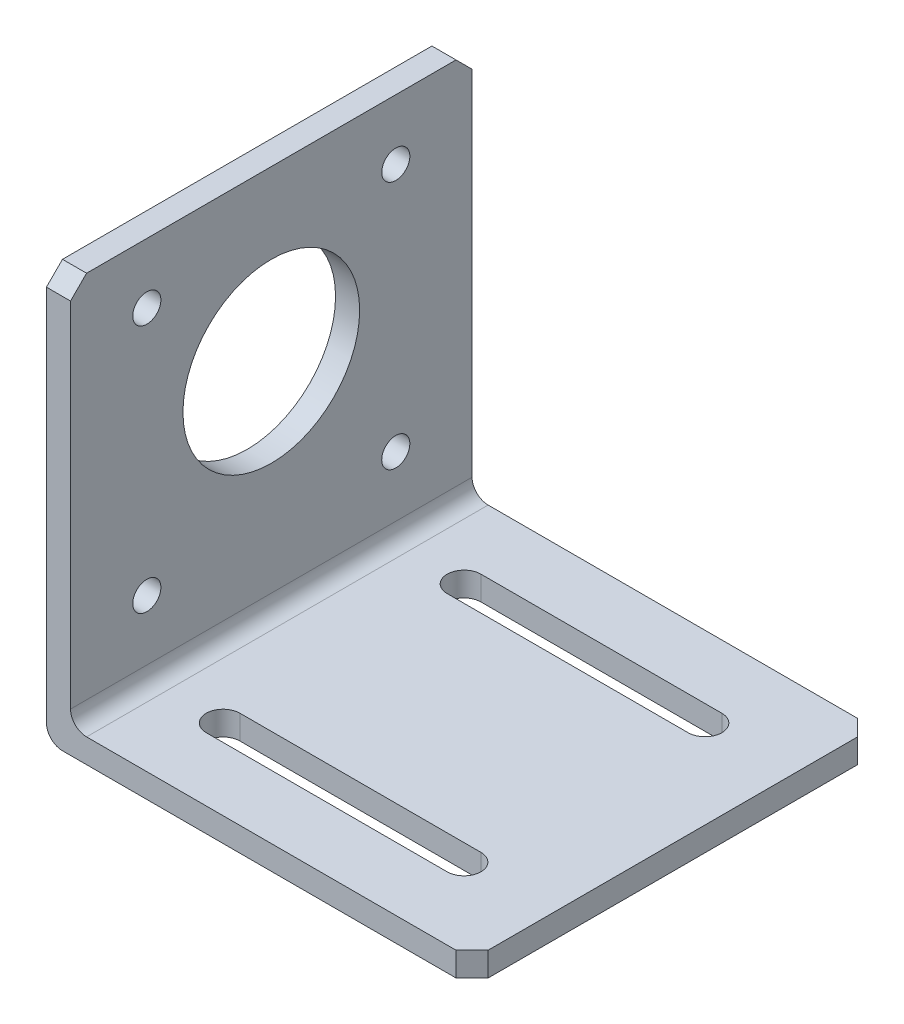
ISO-10303-21;
HEADER;
FILE_DESCRIPTION(('STEP AP214'),'2;1');
FILE_NAME('part.step','',(''),(''),'','','');
FILE_SCHEMA(('AUTOMOTIVE_DESIGN { 1 0 10303 214 1 1 1 1 }'));
ENDSEC;
DATA;
#1=APPLICATION_CONTEXT('core data for automotive mechanical design processes');
#2=APPLICATION_PROTOCOL_DEFINITION('international standard','automotive_design',2000,#1);
#3=PRODUCT_CONTEXT('',#1,'mechanical');
#4=PRODUCT('Part','Part','',(#3));
#5=PRODUCT_RELATED_PRODUCT_CATEGORY('part','',(#4));
#6=PRODUCT_DEFINITION_FORMATION('','',#4);
#7=PRODUCT_DEFINITION_CONTEXT('part definition',#1,'design');
#8=PRODUCT_DEFINITION('design','',#6,#7);
#9=PRODUCT_DEFINITION_SHAPE('','',#8);
#10=(LENGTH_UNIT() NAMED_UNIT(*) SI_UNIT(.MILLI.,.METRE.));
#11=(NAMED_UNIT(*) PLANE_ANGLE_UNIT() SI_UNIT($,.RADIAN.));
#12=(NAMED_UNIT(*) SI_UNIT($,.STERADIAN.) SOLID_ANGLE_UNIT());
#13=UNCERTAINTY_MEASURE_WITH_UNIT(LENGTH_MEASURE(1.E-05),#10,'distance_accuracy_value','');
#14=(GEOMETRIC_REPRESENTATION_CONTEXT(3) GLOBAL_UNCERTAINTY_ASSIGNED_CONTEXT((#13)) GLOBAL_UNIT_ASSIGNED_CONTEXT((#10,
#11,#12)) REPRESENTATION_CONTEXT('',''));
#15=CARTESIAN_POINT('',(0.,0.,0.));
#16=DIRECTION('',(0.,0.,1.));
#17=DIRECTION('',(1.,0.,0.));
#18=AXIS2_PLACEMENT_3D('',#15,#16,#17);
#19=CARTESIAN_POINT('',(2.,2.,0.));
#20=DIRECTION('',(0.,0.,1.));
#21=DIRECTION('',(1.,0.,0.));
#22=AXIS2_PLACEMENT_3D('',#19,#20,#21);
#23=PLANE('',#22);
#24=DIRECTION('',(0.,1.,0.));
#25=VECTOR('',#24,1.);
#26=CARTESIAN_POINT('',(51.,0.,0.));
#27=LINE('',#26,#25);
#28=CARTESIAN_POINT('',(51.,0.,0.));
#29=VERTEX_POINT('',#28);
#30=CARTESIAN_POINT('',(51.,3.,0.));
#31=VERTEX_POINT('',#30);
#32=EDGE_CURVE('E364',#29,#31,#27,.T.);
#33=ORIENTED_EDGE('',*,*,#32,.F.);
#34=DIRECTION('',(1.,0.,0.));
#35=VECTOR('',#34,1.);
#36=CARTESIAN_POINT('',(2.00000000000001,0.,0.));
#37=LINE('',#36,#35);
#38=CARTESIAN_POINT('',(2.00000000000001,0.,0.));
#39=VERTEX_POINT('',#38);
#40=EDGE_CURVE('E214',#39,#29,#37,.T.);
#41=ORIENTED_EDGE('',*,*,#40,.F.);
#42=CARTESIAN_POINT('',(2.,2.,0.));
#43=DIRECTION('',(0.,0.,1.));
#44=DIRECTION('',(1.,0.,0.));
#45=AXIS2_PLACEMENT_3D('',#42,#43,#44);
#46=CIRCLE('',#45,2.);
#47=CARTESIAN_POINT('',(0.,2.00000000000001,0.));
#48=VERTEX_POINT('',#47);
#49=EDGE_CURVE('E211',#48,#39,#46,.T.);
#50=ORIENTED_EDGE('',*,*,#49,.F.);
#51=DIRECTION('',(0.,-1.,0.));
#52=VECTOR('',#51,1.);
#53=CARTESIAN_POINT('',(0.,51.,0.));
#54=LINE('',#53,#52);
#55=CARTESIAN_POINT('',(0.,49.,0.));
#56=VERTEX_POINT('',#55);
#57=EDGE_CURVE('E209',#56,#48,#54,.T.);
#58=ORIENTED_EDGE('',*,*,#57,.F.);
#59=DIRECTION('',(1.,0.,0.));
#60=VECTOR('',#59,1.);
#61=CARTESIAN_POINT('',(0.,49.,0.));
#62=LINE('',#61,#60);
#63=CARTESIAN_POINT('',(3.,49.,0.));
#64=VERTEX_POINT('',#63);
#65=EDGE_CURVE('E304',#56,#64,#62,.T.);
#66=ORIENTED_EDGE('',*,*,#65,.T.);
#67=DIRECTION('',(0.,1.,0.));
#68=VECTOR('',#67,1.);
#69=CARTESIAN_POINT('',(3.,5.00000000000002,0.));
#70=LINE('',#69,#68);
#71=CARTESIAN_POINT('',(3.,5.,0.));
#72=VERTEX_POINT('',#71);
#73=EDGE_CURVE('E221',#72,#64,#70,.T.);
#74=ORIENTED_EDGE('',*,*,#73,.F.);
#75=CARTESIAN_POINT('',(5.,5.,0.));
#76=DIRECTION('',(0.,0.,-1.));
#77=DIRECTION('',(-1.,0.,0.));
#78=AXIS2_PLACEMENT_3D('',#75,#76,#77);
#79=CIRCLE('',#78,2.);
#80=CARTESIAN_POINT('',(5.00000000000001,3.,0.));
#81=VERTEX_POINT('',#80);
#82=EDGE_CURVE('E219',#81,#72,#79,.T.);
#83=ORIENTED_EDGE('',*,*,#82,.F.);
#84=DIRECTION('',(-1.,0.,0.));
#85=VECTOR('',#84,1.);
#86=CARTESIAN_POINT('',(53.,3.,0.));
#87=LINE('',#86,#85);
#88=EDGE_CURVE('E217',#31,#81,#87,.T.);
#89=ORIENTED_EDGE('',*,*,#88,.F.);
#90=EDGE_LOOP('',(#33,#41,#50,#58,#66,#74,#83,#89));
#91=FACE_BOUND('',#90,.T.);
#92=ADVANCED_FACE('F38',(#91),#23,.F.);
#93=CARTESIAN_POINT('',(2.00000000000001,0.,50.));
#94=DIRECTION('',(0.,1.,0.));
#95=DIRECTION('',(0.,0.,1.));
#96=AXIS2_PLACEMENT_3D('',#93,#94,#95);
#97=PLANE('',#96);
#98=DIRECTION('',(1.,0.,0.));
#99=VECTOR('',#98,1.);
#100=CARTESIAN_POINT('',(2.00000000000001,0.,42.1));
#101=LINE('',#100,#99);
#102=CARTESIAN_POINT('',(12.,0.,42.1));
#103=VERTEX_POINT('',#102);
#104=CARTESIAN_POINT('',(42.,0.,42.1));
#105=VERTEX_POINT('',#104);
#106=EDGE_CURVE('E314',#103,#105,#101,.T.);
#107=ORIENTED_EDGE('',*,*,#106,.T.);
#108=CARTESIAN_POINT('',(42.,0.,40.));
#109=DIRECTION('',(0.,1.,0.));
#110=DIRECTION('',(0.,0.,1.));
#111=AXIS2_PLACEMENT_3D('',#108,#109,#110);
#112=CIRCLE('',#111,2.1);
#113=CARTESIAN_POINT('',(42.,0.,37.9));
#114=VERTEX_POINT('',#113);
#115=EDGE_CURVE('E288',#105,#114,#112,.T.);
#116=ORIENTED_EDGE('',*,*,#115,.T.);
#117=DIRECTION('',(1.,0.,0.));
#118=VECTOR('',#117,1.);
#119=CARTESIAN_POINT('',(2.00000000000001,0.,37.9));
#120=LINE('',#119,#118);
#121=CARTESIAN_POINT('',(12.,0.,37.9));
#122=VERTEX_POINT('',#121);
#123=EDGE_CURVE('E317',#122,#114,#120,.T.);
#124=ORIENTED_EDGE('',*,*,#123,.F.);
#125=CARTESIAN_POINT('',(12.,0.,40.));
#126=DIRECTION('',(0.,1.,0.));
#127=DIRECTION('',(0.,0.,1.));
#128=AXIS2_PLACEMENT_3D('',#125,#126,#127);
#129=CIRCLE('',#128,2.1);
#130=EDGE_CURVE('E275',#122,#103,#129,.T.);
#131=ORIENTED_EDGE('',*,*,#130,.T.);
#132=EDGE_LOOP('',(#107,#116,#124,#131));
#133=FACE_BOUND('',#132,.T.);
#134=CARTESIAN_POINT('',(12.,0.,10.));
#135=DIRECTION('',(0.,1.,0.));
#136=DIRECTION('',(0.,0.,1.));
#137=AXIS2_PLACEMENT_3D('',#134,#135,#136);
#138=CIRCLE('',#137,2.1);
#139=CARTESIAN_POINT('',(12.,0.,12.1));
#140=VERTEX_POINT('',#139);
#141=CARTESIAN_POINT('',(12.,0.,7.9));
#142=VERTEX_POINT('',#141);
#143=EDGE_CURVE('E305',#140,#142,#138,.F.);
#144=ORIENTED_EDGE('',*,*,#143,.F.);
#145=DIRECTION('',(1.,0.,0.));
#146=VECTOR('',#145,1.);
#147=CARTESIAN_POINT('',(2.00000000000001,0.,12.1));
#148=LINE('',#147,#146);
#149=CARTESIAN_POINT('',(42.,0.,12.1));
#150=VERTEX_POINT('',#149);
#151=EDGE_CURVE('E311',#140,#150,#148,.T.);
#152=ORIENTED_EDGE('',*,*,#151,.T.);
#153=CARTESIAN_POINT('',(42.,0.,10.));
#154=DIRECTION('',(0.,1.,0.));
#155=DIRECTION('',(0.,0.,1.));
#156=AXIS2_PLACEMENT_3D('',#153,#154,#155);
#157=CIRCLE('',#156,2.1);
#158=CARTESIAN_POINT('',(42.,0.,7.9));
#159=VERTEX_POINT('',#158);
#160=EDGE_CURVE('E309',#159,#150,#157,.F.);
#161=ORIENTED_EDGE('',*,*,#160,.F.);
#162=DIRECTION('',(1.,0.,0.));
#163=VECTOR('',#162,1.);
#164=CARTESIAN_POINT('',(2.00000000000001,0.,7.9));
#165=LINE('',#164,#163);
#166=EDGE_CURVE('E307',#142,#159,#165,.T.);
#167=ORIENTED_EDGE('',*,*,#166,.F.);
#168=EDGE_LOOP('',(#144,#152,#161,#167));
#169=FACE_BOUND('',#168,.T.);
#170=DIRECTION('',(0.,0.,-1.));
#171=VECTOR('',#170,1.);
#172=CARTESIAN_POINT('',(53.,0.,50.));
#173=LINE('',#172,#171);
#174=CARTESIAN_POINT('',(53.,0.,48.));
#175=VERTEX_POINT('',#174);
#176=CARTESIAN_POINT('',(53.,0.,1.99999999999999));
#177=VERTEX_POINT('',#176);
#178=EDGE_CURVE('E190',#175,#177,#173,.T.);
#179=ORIENTED_EDGE('',*,*,#178,.F.);
#180=DIRECTION('',(-0.707106781186549,0.,0.707106781186546));
#181=VECTOR('',#180,1.);
#182=CARTESIAN_POINT('',(53.,0.,48.));
#183=LINE('',#182,#181);
#184=CARTESIAN_POINT('',(51.,0.,50.));
#185=VERTEX_POINT('',#184);
#186=EDGE_CURVE('E175',#175,#185,#183,.T.);
#187=ORIENTED_EDGE('',*,*,#186,.T.);
#188=DIRECTION('',(1.,0.,0.));
#189=VECTOR('',#188,1.);
#190=CARTESIAN_POINT('',(2.00000000000001,0.,50.));
#191=LINE('',#190,#189);
#192=CARTESIAN_POINT('',(2.00000000000001,0.,50.));
#193=VERTEX_POINT('',#192);
#194=EDGE_CURVE('E187',#193,#185,#191,.T.);
#195=ORIENTED_EDGE('',*,*,#194,.F.);
#196=DIRECTION('',(0.,0.,-1.));
#197=VECTOR('',#196,1.);
#198=CARTESIAN_POINT('',(2.00000000000001,0.,50.));
#199=LINE('',#198,#197);
#200=EDGE_CURVE('E236',#193,#39,#199,.T.);
#201=ORIENTED_EDGE('',*,*,#200,.T.);
#202=ORIENTED_EDGE('',*,*,#40,.T.);
#203=DIRECTION('',(-0.707106781186549,0.,-0.707106781186546));
#204=VECTOR('',#203,1.);
#205=CARTESIAN_POINT('',(53.,0.,1.99999999999999));
#206=LINE('',#205,#204);
#207=EDGE_CURVE('E366',#177,#29,#206,.T.);
#208=ORIENTED_EDGE('',*,*,#207,.F.);
#209=EDGE_LOOP('',(#179,#187,#195,#201,#202,#208));
#210=FACE_BOUND('',#209,.T.);
#211=ADVANCED_FACE('F185',(#133,#169,#210),#97,.F.);
#212=CARTESIAN_POINT('',(53.,3.,50.));
#213=DIRECTION('',(0.,-1.,0.));
#214=DIRECTION('',(0.,0.,-1.));
#215=AXIS2_PLACEMENT_3D('',#212,#213,#214);
#216=PLANE('',#215);
#217=DIRECTION('',(-1.,0.,0.));
#218=VECTOR('',#217,1.);
#219=CARTESIAN_POINT('',(53.,3.,37.9));
#220=LINE('',#219,#218);
#221=CARTESIAN_POINT('',(42.,3.,37.9));
#222=VERTEX_POINT('',#221);
#223=CARTESIAN_POINT('',(12.,3.,37.9));
#224=VERTEX_POINT('',#223);
#225=EDGE_CURVE('E46',#222,#224,#220,.T.);
#226=ORIENTED_EDGE('',*,*,#225,.F.);
#227=CARTESIAN_POINT('',(42.,3.,40.));
#228=DIRECTION('',(0.,-1.,0.));
#229=DIRECTION('',(0.,0.,-1.));
#230=AXIS2_PLACEMENT_3D('',#227,#228,#229);
#231=CIRCLE('',#230,2.1);
#232=CARTESIAN_POINT('',(42.,3.,42.1));
#233=VERTEX_POINT('',#232);
#234=EDGE_CURVE('E11',#222,#233,#231,.T.);
#235=ORIENTED_EDGE('',*,*,#234,.T.);
#236=DIRECTION('',(-1.,0.,0.));
#237=VECTOR('',#236,1.);
#238=CARTESIAN_POINT('',(53.,3.,42.1));
#239=LINE('',#238,#237);
#240=CARTESIAN_POINT('',(12.,3.,42.1));
#241=VERTEX_POINT('',#240);
#242=EDGE_CURVE('E254',#233,#241,#239,.T.);
#243=ORIENTED_EDGE('',*,*,#242,.T.);
#244=CARTESIAN_POINT('',(12.,3.,40.));
#245=DIRECTION('',(0.,-1.,0.));
#246=DIRECTION('',(0.,0.,-1.));
#247=AXIS2_PLACEMENT_3D('',#244,#245,#246);
#248=CIRCLE('',#247,2.1);
#249=EDGE_CURVE('E257',#241,#224,#248,.T.);
#250=ORIENTED_EDGE('',*,*,#249,.T.);
#251=EDGE_LOOP('',(#226,#235,#243,#250));
#252=FACE_BOUND('',#251,.T.);
#253=CARTESIAN_POINT('',(42.,3.,10.));
#254=DIRECTION('',(0.,-1.,0.));
#255=DIRECTION('',(0.,0.,-1.));
#256=AXIS2_PLACEMENT_3D('',#253,#254,#255);
#257=CIRCLE('',#256,2.1);
#258=CARTESIAN_POINT('',(42.,3.,12.1));
#259=VERTEX_POINT('',#258);
#260=CARTESIAN_POINT('',(42.,3.,7.9));
#261=VERTEX_POINT('',#260);
#262=EDGE_CURVE('E249',#259,#261,#257,.F.);
#263=ORIENTED_EDGE('',*,*,#262,.F.);
#264=DIRECTION('',(-1.,0.,0.));
#265=VECTOR('',#264,1.);
#266=CARTESIAN_POINT('',(53.,3.,12.1));
#267=LINE('',#266,#265);
#268=CARTESIAN_POINT('',(12.,3.,12.1));
#269=VERTEX_POINT('',#268);
#270=EDGE_CURVE('E251',#259,#269,#267,.T.);
#271=ORIENTED_EDGE('',*,*,#270,.T.);
#272=CARTESIAN_POINT('',(12.,3.,10.));
#273=DIRECTION('',(0.,-1.,0.));
#274=DIRECTION('',(0.,0.,-1.));
#275=AXIS2_PLACEMENT_3D('',#272,#273,#274);
#276=CIRCLE('',#275,2.1);
#277=CARTESIAN_POINT('',(12.,3.,7.9));
#278=VERTEX_POINT('',#277);
#279=EDGE_CURVE('E244',#278,#269,#276,.F.);
#280=ORIENTED_EDGE('',*,*,#279,.F.);
#281=DIRECTION('',(-1.,0.,0.));
#282=VECTOR('',#281,1.);
#283=CARTESIAN_POINT('',(53.,3.,7.9));
#284=LINE('',#283,#282);
#285=EDGE_CURVE('E246',#261,#278,#284,.T.);
#286=ORIENTED_EDGE('',*,*,#285,.F.);
#287=EDGE_LOOP('',(#263,#271,#280,#286));
#288=FACE_BOUND('',#287,.T.);
#289=DIRECTION('',(-1.,0.,0.));
#290=VECTOR('',#289,1.);
#291=CARTESIAN_POINT('',(53.,3.,50.));
#292=LINE('',#291,#290);
#293=CARTESIAN_POINT('',(51.,3.,50.));
#294=VERTEX_POINT('',#293);
#295=CARTESIAN_POINT('',(5.00000000000001,3.,50.));
#296=VERTEX_POINT('',#295);
#297=EDGE_CURVE('E196',#294,#296,#292,.T.);
#298=ORIENTED_EDGE('',*,*,#297,.F.);
#299=DIRECTION('',(-0.707106781186549,0.,0.707106781186546));
#300=VECTOR('',#299,1.);
#301=CARTESIAN_POINT('',(53.,3.,48.));
#302=LINE('',#301,#300);
#303=CARTESIAN_POINT('',(53.,3.,48.));
#304=VERTEX_POINT('',#303);
#305=EDGE_CURVE('E61',#304,#294,#302,.T.);
#306=ORIENTED_EDGE('',*,*,#305,.F.);
#307=DIRECTION('',(0.,0.,-1.));
#308=VECTOR('',#307,1.);
#309=CARTESIAN_POINT('',(53.,3.,50.));
#310=LINE('',#309,#308);
#311=CARTESIAN_POINT('',(53.,3.,1.99999999999999));
#312=VERTEX_POINT('',#311);
#313=EDGE_CURVE('E232',#304,#312,#310,.T.);
#314=ORIENTED_EDGE('',*,*,#313,.T.);
#315=DIRECTION('',(-0.707106781186549,0.,-0.707106781186546));
#316=VECTOR('',#315,1.);
#317=CARTESIAN_POINT('',(53.,3.,1.99999999999999));
#318=LINE('',#317,#316);
#319=EDGE_CURVE('E53',#312,#31,#318,.T.);
#320=ORIENTED_EDGE('',*,*,#319,.T.);
#321=ORIENTED_EDGE('',*,*,#88,.T.);
#322=DIRECTION('',(0.,0.,-1.));
#323=VECTOR('',#322,1.);
#324=CARTESIAN_POINT('',(5.00000000000001,3.,50.));
#325=LINE('',#324,#323);
#326=EDGE_CURVE('E229',#296,#81,#325,.T.);
#327=ORIENTED_EDGE('',*,*,#326,.F.);
#328=EDGE_LOOP('',(#298,#306,#314,#320,#321,#327));
#329=FACE_BOUND('',#328,.T.);
#330=ADVANCED_FACE('F278',(#252,#288,#329),#216,.F.);
#331=CARTESIAN_POINT('',(53.,0.,50.));
#332=DIRECTION('',(-1.,0.,0.));
#333=DIRECTION('',(0.,0.,1.));
#334=AXIS2_PLACEMENT_3D('',#331,#332,#333);
#335=PLANE('',#334);
#336=ORIENTED_EDGE('',*,*,#313,.F.);
#337=DIRECTION('',(0.,1.,0.));
#338=VECTOR('',#337,1.);
#339=CARTESIAN_POINT('',(53.,0.,48.));
#340=LINE('',#339,#338);
#341=EDGE_CURVE('E180',#175,#304,#340,.T.);
#342=ORIENTED_EDGE('',*,*,#341,.F.);
#343=ORIENTED_EDGE('',*,*,#178,.T.);
#344=DIRECTION('',(0.,1.,0.));
#345=VECTOR('',#344,1.);
#346=CARTESIAN_POINT('',(53.,0.,1.99999999999999));
#347=LINE('',#346,#345);
#348=EDGE_CURVE('E367',#177,#312,#347,.T.);
#349=ORIENTED_EDGE('',*,*,#348,.T.);
#350=EDGE_LOOP('',(#336,#342,#343,#349));
#351=FACE_BOUND('',#350,.T.);
#352=ADVANCED_FACE('F440',(#351),#335,.F.);
#353=CARTESIAN_POINT('',(0.,51.,50.));
#354=DIRECTION('',(1.,0.,0.));
#355=DIRECTION('',(0.,1.,0.));
#356=AXIS2_PLACEMENT_3D('',#353,#354,#355);
#357=PLANE('',#356);
#358=CARTESIAN_POINT('',(0.,12.5,40.5));
#359=DIRECTION('',(1.,0.,0.));
#360=DIRECTION('',(0.,0.,-1.));
#361=AXIS2_PLACEMENT_3D('',#358,#359,#360);
#362=CIRCLE('',#361,1.75);
#363=CARTESIAN_POINT('',(0.,12.5,38.75));
#364=VERTEX_POINT('',#363);
#365=EDGE_CURVE('E337',#364,#364,#362,.T.);
#366=ORIENTED_EDGE('',*,*,#365,.T.);
#367=EDGE_LOOP('',(#366));
#368=FACE_BOUND('',#367,.T.);
#369=CARTESIAN_POINT('',(0.,30.,25.));
#370=DIRECTION('',(1.,0.,0.));
#371=DIRECTION('',(0.,0.,-1.));
#372=AXIS2_PLACEMENT_3D('',#369,#370,#371);
#373=CIRCLE('',#372,11.);
#374=CARTESIAN_POINT('',(0.,30.,14.));
#375=VERTEX_POINT('',#374);
#376=EDGE_CURVE('E325',#375,#375,#373,.T.);
#377=ORIENTED_EDGE('',*,*,#376,.T.);
#378=EDGE_LOOP('',(#377));
#379=FACE_BOUND('',#378,.T.);
#380=CARTESIAN_POINT('',(0.,43.5,40.5));
#381=DIRECTION('',(-1.,0.,0.));
#382=DIRECTION('',(0.,0.,1.));
#383=AXIS2_PLACEMENT_3D('',#380,#381,#382);
#384=CIRCLE('',#383,1.75);
#385=CARTESIAN_POINT('',(0.,43.5,42.25));
#386=VERTEX_POINT('',#385);
#387=EDGE_CURVE('E212',#386,#386,#384,.T.);
#388=ORIENTED_EDGE('',*,*,#387,.F.);
#389=EDGE_LOOP('',(#388));
#390=FACE_BOUND('',#389,.T.);
#391=CARTESIAN_POINT('',(0.,43.5,9.5));
#392=DIRECTION('',(1.,0.,0.));
#393=DIRECTION('',(0.,0.,-1.));
#394=AXIS2_PLACEMENT_3D('',#391,#392,#393);
#395=CIRCLE('',#394,1.75);
#396=CARTESIAN_POINT('',(0.,43.5,7.75));
#397=VERTEX_POINT('',#396);
#398=EDGE_CURVE('E331',#397,#397,#395,.T.);
#399=ORIENTED_EDGE('',*,*,#398,.T.);
#400=EDGE_LOOP('',(#399));
#401=FACE_BOUND('',#400,.T.);
#402=CARTESIAN_POINT('',(0.,12.5,9.5));
#403=DIRECTION('',(-1.,0.,0.));
#404=DIRECTION('',(0.,0.,1.));
#405=AXIS2_PLACEMENT_3D('',#402,#403,#404);
#406=CIRCLE('',#405,1.75);
#407=CARTESIAN_POINT('',(0.,12.5,11.25));
#408=VERTEX_POINT('',#407);
#409=EDGE_CURVE('E320',#408,#408,#406,.T.);
#410=ORIENTED_EDGE('',*,*,#409,.F.);
#411=EDGE_LOOP('',(#410));
#412=FACE_BOUND('',#411,.T.);
#413=DIRECTION('',(0.,0.707106781186546,0.707106781186549));
#414=VECTOR('',#413,1.);
#415=CARTESIAN_POINT('',(0.,49.,0.));
#416=LINE('',#415,#414);
#417=CARTESIAN_POINT('',(0.,51.,2.));
#418=VERTEX_POINT('',#417);
#419=EDGE_CURVE('E373',#56,#418,#416,.T.);
#420=ORIENTED_EDGE('',*,*,#419,.F.);
#421=ORIENTED_EDGE('',*,*,#57,.T.);
#422=DIRECTION('',(0.,0.,-1.));
#423=VECTOR('',#422,1.);
#424=CARTESIAN_POINT('',(0.,2.00000000000001,50.));
#425=LINE('',#424,#423);
#426=CARTESIAN_POINT('',(0.,2.00000000000001,50.));
#427=VERTEX_POINT('',#426);
#428=EDGE_CURVE('E238',#427,#48,#425,.T.);
#429=ORIENTED_EDGE('',*,*,#428,.F.);
#430=DIRECTION('',(0.,-1.,0.));
#431=VECTOR('',#430,1.);
#432=CARTESIAN_POINT('',(0.,51.,50.));
#433=LINE('',#432,#431);
#434=CARTESIAN_POINT('',(0.,49.,50.));
#435=VERTEX_POINT('',#434);
#436=EDGE_CURVE('E200',#435,#427,#433,.T.);
#437=ORIENTED_EDGE('',*,*,#436,.F.);
#438=DIRECTION('',(0.,0.707106781186546,-0.707106781186549));
#439=VECTOR('',#438,1.);
#440=CARTESIAN_POINT('',(0.,49.,50.));
#441=LINE('',#440,#439);
#442=CARTESIAN_POINT('',(0.,51.,48.));
#443=VERTEX_POINT('',#442);
#444=EDGE_CURVE('E387',#435,#443,#441,.T.);
#445=ORIENTED_EDGE('',*,*,#444,.T.);
#446=DIRECTION('',(0.,0.,-1.));
#447=VECTOR('',#446,1.);
#448=CARTESIAN_POINT('',(0.,51.,50.));
#449=LINE('',#448,#447);
#450=EDGE_CURVE('E241',#443,#418,#449,.T.);
#451=ORIENTED_EDGE('',*,*,#450,.T.);
#452=EDGE_LOOP('',(#420,#421,#429,#437,#445,#451));
#453=FACE_BOUND('',#452,.T.);
#454=ADVANCED_FACE('F355',(#368,#379,#390,#401,#412,#453),#357,.F.);
#455=CARTESIAN_POINT('',(3.,5.00000000000002,50.));
#456=DIRECTION('',(-1.,0.,0.));
#457=DIRECTION('',(0.,0.,1.));
#458=AXIS2_PLACEMENT_3D('',#455,#456,#457);
#459=PLANE('',#458);
#460=CARTESIAN_POINT('',(3.,12.5,40.5));
#461=DIRECTION('',(1.,0.,0.));
#462=DIRECTION('',(0.,0.,-1.));
#463=AXIS2_PLACEMENT_3D('',#460,#461,#462);
#464=CIRCLE('',#463,1.75);
#465=CARTESIAN_POINT('',(3.,12.5,38.75));
#466=VERTEX_POINT('',#465);
#467=EDGE_CURVE('E334',#466,#466,#464,.T.);
#468=ORIENTED_EDGE('',*,*,#467,.F.);
#469=EDGE_LOOP('',(#468));
#470=FACE_BOUND('',#469,.T.);
#471=CARTESIAN_POINT('',(3.,30.,25.));
#472=DIRECTION('',(1.,0.,0.));
#473=DIRECTION('',(0.,0.,-1.));
#474=AXIS2_PLACEMENT_3D('',#471,#472,#473);
#475=CIRCLE('',#474,11.);
#476=CARTESIAN_POINT('',(3.,30.,14.));
#477=VERTEX_POINT('',#476);
#478=EDGE_CURVE('E321',#477,#477,#475,.T.);
#479=ORIENTED_EDGE('',*,*,#478,.F.);
#480=EDGE_LOOP('',(#479));
#481=FACE_BOUND('',#480,.T.);
#482=CARTESIAN_POINT('',(3.,43.5,40.5));
#483=DIRECTION('',(-1.,0.,0.));
#484=DIRECTION('',(0.,0.,1.));
#485=AXIS2_PLACEMENT_3D('',#482,#483,#484);
#486=CIRCLE('',#485,1.75);
#487=CARTESIAN_POINT('',(3.,43.5,42.25));
#488=VERTEX_POINT('',#487);
#489=EDGE_CURVE('E324',#488,#488,#486,.T.);
#490=ORIENTED_EDGE('',*,*,#489,.T.);
#491=EDGE_LOOP('',(#490));
#492=FACE_BOUND('',#491,.T.);
#493=CARTESIAN_POINT('',(3.,43.5,9.5));
#494=DIRECTION('',(1.,0.,0.));
#495=DIRECTION('',(0.,0.,-1.));
#496=AXIS2_PLACEMENT_3D('',#493,#494,#495);
#497=CIRCLE('',#496,1.75);
#498=CARTESIAN_POINT('',(3.,43.5,7.75));
#499=VERTEX_POINT('',#498);
#500=EDGE_CURVE('E328',#499,#499,#497,.T.);
#501=ORIENTED_EDGE('',*,*,#500,.F.);
#502=EDGE_LOOP('',(#501));
#503=FACE_BOUND('',#502,.T.);
#504=CARTESIAN_POINT('',(3.,12.5,9.5));
#505=DIRECTION('',(-1.,0.,0.));
#506=DIRECTION('',(0.,0.,1.));
#507=AXIS2_PLACEMENT_3D('',#504,#505,#506);
#508=CIRCLE('',#507,1.75);
#509=CARTESIAN_POINT('',(3.,12.5,11.25));
#510=VERTEX_POINT('',#509);
#511=EDGE_CURVE('E340',#510,#510,#508,.T.);
#512=ORIENTED_EDGE('',*,*,#511,.T.);
#513=EDGE_LOOP('',(#512));
#514=FACE_BOUND('',#513,.T.);
#515=DIRECTION('',(0.,0.707106781186546,0.707106781186549));
#516=VECTOR('',#515,1.);
#517=CARTESIAN_POINT('',(3.,49.,0.));
#518=LINE('',#517,#516);
#519=CARTESIAN_POINT('',(3.,51.,2.));
#520=VERTEX_POINT('',#519);
#521=EDGE_CURVE('E376',#64,#520,#518,.T.);
#522=ORIENTED_EDGE('',*,*,#521,.T.);
#523=DIRECTION('',(0.,0.,-1.));
#524=VECTOR('',#523,1.);
#525=CARTESIAN_POINT('',(3.,51.,50.));
#526=LINE('',#525,#524);
#527=CARTESIAN_POINT('',(3.,51.,48.));
#528=VERTEX_POINT('',#527);
#529=EDGE_CURVE('E208',#528,#520,#526,.T.);
#530=ORIENTED_EDGE('',*,*,#529,.F.);
#531=DIRECTION('',(0.,0.707106781186546,-0.707106781186549));
#532=VECTOR('',#531,1.);
#533=CARTESIAN_POINT('',(3.,49.,50.));
#534=LINE('',#533,#532);
#535=CARTESIAN_POINT('',(3.,49.,50.));
#536=VERTEX_POINT('',#535);
#537=EDGE_CURVE('E379',#536,#528,#534,.T.);
#538=ORIENTED_EDGE('',*,*,#537,.F.);
#539=DIRECTION('',(0.,1.,0.));
#540=VECTOR('',#539,1.);
#541=CARTESIAN_POINT('',(3.,5.00000000000002,50.));
#542=LINE('',#541,#540);
#543=CARTESIAN_POINT('',(3.,5.,50.));
#544=VERTEX_POINT('',#543);
#545=EDGE_CURVE('E205',#544,#536,#542,.T.);
#546=ORIENTED_EDGE('',*,*,#545,.F.);
#547=DIRECTION('',(0.,0.,-1.));
#548=VECTOR('',#547,1.);
#549=CARTESIAN_POINT('',(3.,5.,50.));
#550=LINE('',#549,#548);
#551=EDGE_CURVE('E226',#544,#72,#550,.T.);
#552=ORIENTED_EDGE('',*,*,#551,.T.);
#553=ORIENTED_EDGE('',*,*,#73,.T.);
#554=EDGE_LOOP('',(#522,#530,#538,#546,#552,#553));
#555=FACE_BOUND('',#554,.T.);
#556=ADVANCED_FACE('F430',(#470,#481,#492,#503,#514,#555),#459,.F.);
#557=CARTESIAN_POINT('',(3.,51.,50.));
#558=DIRECTION('',(0.,-1.,0.));
#559=DIRECTION('',(0.,0.,-1.));
#560=AXIS2_PLACEMENT_3D('',#557,#558,#559);
#561=PLANE('',#560);
#562=DIRECTION('',(1.,0.,0.));
#563=VECTOR('',#562,1.);
#564=CARTESIAN_POINT('',(0.,51.,2.));
#565=LINE('',#564,#563);
#566=EDGE_CURVE('E375',#418,#520,#565,.T.);
#567=ORIENTED_EDGE('',*,*,#566,.F.);
#568=ORIENTED_EDGE('',*,*,#450,.F.);
#569=DIRECTION('',(1.,0.,0.));
#570=VECTOR('',#569,1.);
#571=CARTESIAN_POINT('',(0.,51.,48.));
#572=LINE('',#571,#570);
#573=EDGE_CURVE('E383',#443,#528,#572,.T.);
#574=ORIENTED_EDGE('',*,*,#573,.T.);
#575=ORIENTED_EDGE('',*,*,#529,.T.);
#576=EDGE_LOOP('',(#567,#568,#574,#575));
#577=FACE_BOUND('',#576,.T.);
#578=ADVANCED_FACE('F40',(#577),#561,.F.);
#579=CARTESIAN_POINT('',(2.,2.,50.));
#580=DIRECTION('',(0.,0.,-1.));
#581=DIRECTION('',(-1.,0.,0.));
#582=AXIS2_PLACEMENT_3D('',#579,#580,#581);
#583=CYLINDRICAL_SURFACE('',#582,2.);
#584=ORIENTED_EDGE('',*,*,#49,.T.);
#585=ORIENTED_EDGE('',*,*,#200,.F.);
#586=CARTESIAN_POINT('',(2.,2.,50.));
#587=DIRECTION('',(0.,0.,1.));
#588=DIRECTION('',(1.,0.,0.));
#589=AXIS2_PLACEMENT_3D('',#586,#587,#588);
#590=CIRCLE('',#589,2.);
#591=EDGE_CURVE('E194',#427,#193,#590,.T.);
#592=ORIENTED_EDGE('',*,*,#591,.F.);
#593=ORIENTED_EDGE('',*,*,#428,.T.);
#594=EDGE_LOOP('',(#584,#585,#592,#593));
#595=FACE_BOUND('',#594,.T.);
#596=ADVANCED_FACE('F359',(#595),#583,.T.);
#597=CARTESIAN_POINT('',(5.,5.,50.));
#598=DIRECTION('',(0.,0.,-1.));
#599=DIRECTION('',(-1.,0.,0.));
#600=AXIS2_PLACEMENT_3D('',#597,#598,#599);
#601=CYLINDRICAL_SURFACE('',#600,2.);
#602=ORIENTED_EDGE('',*,*,#82,.T.);
#603=ORIENTED_EDGE('',*,*,#551,.F.);
#604=CARTESIAN_POINT('',(5.,5.,50.));
#605=DIRECTION('',(0.,0.,-1.));
#606=DIRECTION('',(-1.,0.,0.));
#607=AXIS2_PLACEMENT_3D('',#604,#605,#606);
#608=CIRCLE('',#607,2.);
#609=EDGE_CURVE('E198',#296,#544,#608,.T.);
#610=ORIENTED_EDGE('',*,*,#609,.F.);
#611=ORIENTED_EDGE('',*,*,#326,.T.);
#612=EDGE_LOOP('',(#602,#603,#610,#611));
#613=FACE_BOUND('',#612,.T.);
#614=ADVANCED_FACE('F434',(#613),#601,.F.);
#615=CARTESIAN_POINT('',(2.,2.,50.));
#616=DIRECTION('',(0.,0.,1.));
#617=DIRECTION('',(1.,0.,0.));
#618=AXIS2_PLACEMENT_3D('',#615,#616,#617);
#619=PLANE('',#618);
#620=DIRECTION('',(0.,1.,0.));
#621=VECTOR('',#620,1.);
#622=CARTESIAN_POINT('',(51.,0.,50.));
#623=LINE('',#622,#621);
#624=EDGE_CURVE('E172',#185,#294,#623,.T.);
#625=ORIENTED_EDGE('',*,*,#624,.T.);
#626=ORIENTED_EDGE('',*,*,#297,.T.);
#627=ORIENTED_EDGE('',*,*,#609,.T.);
#628=ORIENTED_EDGE('',*,*,#545,.T.);
#629=DIRECTION('',(1.,0.,0.));
#630=VECTOR('',#629,1.);
#631=CARTESIAN_POINT('',(0.,49.,50.));
#632=LINE('',#631,#630);
#633=EDGE_CURVE('E351',#435,#536,#632,.T.);
#634=ORIENTED_EDGE('',*,*,#633,.F.);
#635=ORIENTED_EDGE('',*,*,#436,.T.);
#636=ORIENTED_EDGE('',*,*,#591,.T.);
#637=ORIENTED_EDGE('',*,*,#194,.T.);
#638=EDGE_LOOP('',(#625,#626,#627,#628,#634,#635,#636,#637));
#639=FACE_BOUND('',#638,.T.);
#640=ADVANCED_FACE('F192',(#639),#619,.T.);
#641=CARTESIAN_POINT('',(0.,43.5,40.5));
#642=DIRECTION('',(1.,0.,0.));
#643=DIRECTION('',(0.,0.,-1.));
#644=AXIS2_PLACEMENT_3D('',#641,#642,#643);
#645=CYLINDRICAL_SURFACE('',#644,1.75);
#646=ORIENTED_EDGE('',*,*,#387,.T.);
#647=EDGE_LOOP('',(#646));
#648=FACE_BOUND('',#647,.T.);
#649=ORIENTED_EDGE('',*,*,#489,.F.);
#650=EDGE_LOOP('',(#649));
#651=FACE_BOUND('',#650,.T.);
#652=ADVANCED_FACE('F575',(#648,#651),#645,.F.);
#653=CARTESIAN_POINT('',(0.,30.,25.));
#654=DIRECTION('',(1.,0.,0.));
#655=DIRECTION('',(0.,0.,-1.));
#656=AXIS2_PLACEMENT_3D('',#653,#654,#655);
#657=CYLINDRICAL_SURFACE('',#656,11.);
#658=ORIENTED_EDGE('',*,*,#376,.F.);
#659=EDGE_LOOP('',(#658));
#660=FACE_BOUND('',#659,.T.);
#661=ORIENTED_EDGE('',*,*,#478,.T.);
#662=EDGE_LOOP('',(#661));
#663=FACE_BOUND('',#662,.T.);
#664=ADVANCED_FACE('F598',(#660,#663),#657,.F.);
#665=CARTESIAN_POINT('',(0.,43.5,9.5));
#666=DIRECTION('',(1.,0.,0.));
#667=DIRECTION('',(0.,0.,-1.));
#668=AXIS2_PLACEMENT_3D('',#665,#666,#667);
#669=CYLINDRICAL_SURFACE('',#668,1.75);
#670=ORIENTED_EDGE('',*,*,#398,.F.);
#671=EDGE_LOOP('',(#670));
#672=FACE_BOUND('',#671,.T.);
#673=ORIENTED_EDGE('',*,*,#500,.T.);
#674=EDGE_LOOP('',(#673));
#675=FACE_BOUND('',#674,.T.);
#676=ADVANCED_FACE('F604',(#672,#675),#669,.F.);
#677=CARTESIAN_POINT('',(0.,12.5,40.5));
#678=DIRECTION('',(1.,0.,0.));
#679=DIRECTION('',(0.,0.,-1.));
#680=AXIS2_PLACEMENT_3D('',#677,#678,#679);
#681=CYLINDRICAL_SURFACE('',#680,1.75);
#682=ORIENTED_EDGE('',*,*,#365,.F.);
#683=EDGE_LOOP('',(#682));
#684=FACE_BOUND('',#683,.T.);
#685=ORIENTED_EDGE('',*,*,#467,.T.);
#686=EDGE_LOOP('',(#685));
#687=FACE_BOUND('',#686,.T.);
#688=ADVANCED_FACE('F461',(#684,#687),#681,.F.);
#689=CARTESIAN_POINT('',(0.,12.5,9.5));
#690=DIRECTION('',(1.,0.,0.));
#691=DIRECTION('',(0.,0.,-1.));
#692=AXIS2_PLACEMENT_3D('',#689,#690,#691);
#693=CYLINDRICAL_SURFACE('',#692,1.75);
#694=ORIENTED_EDGE('',*,*,#409,.T.);
#695=EDGE_LOOP('',(#694));
#696=FACE_BOUND('',#695,.T.);
#697=ORIENTED_EDGE('',*,*,#511,.F.);
#698=EDGE_LOOP('',(#697));
#699=FACE_BOUND('',#698,.T.);
#700=ADVANCED_FACE('F420',(#696,#699),#693,.F.);
#701=CARTESIAN_POINT('',(42.,51.,12.1));
#702=DIRECTION('',(0.,0.,1.));
#703=DIRECTION('',(1.,0.,0.));
#704=AXIS2_PLACEMENT_3D('',#701,#702,#703);
#705=PLANE('',#704);
#706=DIRECTION('',(0.,-1.,0.));
#707=VECTOR('',#706,1.);
#708=CARTESIAN_POINT('',(12.,51.,12.1));
#709=LINE('',#708,#707);
#710=EDGE_CURVE('E290',#269,#140,#709,.T.);
#711=ORIENTED_EDGE('',*,*,#710,.F.);
#712=ORIENTED_EDGE('',*,*,#270,.F.);
#713=DIRECTION('',(0.,-1.,0.));
#714=VECTOR('',#713,1.);
#715=CARTESIAN_POINT('',(42.,51.,12.1));
#716=LINE('',#715,#714);
#717=EDGE_CURVE('E301',#259,#150,#716,.T.);
#718=ORIENTED_EDGE('',*,*,#717,.T.);
#719=ORIENTED_EDGE('',*,*,#151,.F.);
#720=EDGE_LOOP('',(#711,#712,#718,#719));
#721=FACE_BOUND('',#720,.T.);
#722=ADVANCED_FACE('F409',(#721),#705,.F.);
#723=CARTESIAN_POINT('',(42.,51.,10.));
#724=DIRECTION('',(0.,-1.,0.));
#725=DIRECTION('',(0.,0.,-1.));
#726=AXIS2_PLACEMENT_3D('',#723,#724,#725);
#727=CYLINDRICAL_SURFACE('',#726,2.1);
#728=ORIENTED_EDGE('',*,*,#160,.T.);
#729=ORIENTED_EDGE('',*,*,#717,.F.);
#730=ORIENTED_EDGE('',*,*,#262,.T.);
#731=DIRECTION('',(0.,-1.,0.));
#732=VECTOR('',#731,1.);
#733=CARTESIAN_POINT('',(42.,51.,7.9));
#734=LINE('',#733,#732);
#735=EDGE_CURVE('E298',#261,#159,#734,.T.);
#736=ORIENTED_EDGE('',*,*,#735,.T.);
#737=EDGE_LOOP('',(#728,#729,#730,#736));
#738=FACE_BOUND('',#737,.T.);
#739=ADVANCED_FACE('F412',(#738),#727,.F.);
#740=CARTESIAN_POINT('',(42.,51.,7.9));
#741=DIRECTION('',(0.,0.,1.));
#742=DIRECTION('',(1.,0.,0.));
#743=AXIS2_PLACEMENT_3D('',#740,#741,#742);
#744=PLANE('',#743);
#745=ORIENTED_EDGE('',*,*,#166,.T.);
#746=ORIENTED_EDGE('',*,*,#735,.F.);
#747=ORIENTED_EDGE('',*,*,#285,.T.);
#748=DIRECTION('',(0.,-1.,0.));
#749=VECTOR('',#748,1.);
#750=CARTESIAN_POINT('',(12.,51.,7.9));
#751=LINE('',#750,#749);
#752=EDGE_CURVE('E293',#278,#142,#751,.T.);
#753=ORIENTED_EDGE('',*,*,#752,.T.);
#754=EDGE_LOOP('',(#745,#746,#747,#753));
#755=FACE_BOUND('',#754,.T.);
#756=ADVANCED_FACE('F402',(#755),#744,.T.);
#757=CARTESIAN_POINT('',(12.,51.,10.));
#758=DIRECTION('',(0.,-1.,0.));
#759=DIRECTION('',(0.,0.,-1.));
#760=AXIS2_PLACEMENT_3D('',#757,#758,#759);
#761=CYLINDRICAL_SURFACE('',#760,2.1);
#762=ORIENTED_EDGE('',*,*,#143,.T.);
#763=ORIENTED_EDGE('',*,*,#752,.F.);
#764=ORIENTED_EDGE('',*,*,#279,.T.);
#765=ORIENTED_EDGE('',*,*,#710,.T.);
#766=EDGE_LOOP('',(#762,#763,#764,#765));
#767=FACE_BOUND('',#766,.T.);
#768=ADVANCED_FACE('F399',(#767),#761,.F.);
#769=CARTESIAN_POINT('',(42.,51.,40.));
#770=DIRECTION('',(0.,-1.,0.));
#771=DIRECTION('',(0.,0.,-1.));
#772=AXIS2_PLACEMENT_3D('',#769,#770,#771);
#773=CYLINDRICAL_SURFACE('',#772,2.1);
#774=DIRECTION('',(0.,-1.,0.));
#775=VECTOR('',#774,1.);
#776=CARTESIAN_POINT('',(42.,51.,42.1));
#777=LINE('',#776,#775);
#778=EDGE_CURVE('E283',#233,#105,#777,.T.);
#779=ORIENTED_EDGE('',*,*,#778,.F.);
#780=ORIENTED_EDGE('',*,*,#234,.F.);
#781=DIRECTION('',(0.,-1.,0.));
#782=VECTOR('',#781,1.);
#783=CARTESIAN_POINT('',(42.,51.,37.9));
#784=LINE('',#783,#782);
#785=EDGE_CURVE('E268',#222,#114,#784,.T.);
#786=ORIENTED_EDGE('',*,*,#785,.T.);
#787=ORIENTED_EDGE('',*,*,#115,.F.);
#788=EDGE_LOOP('',(#779,#780,#786,#787));
#789=FACE_BOUND('',#788,.T.);
#790=ADVANCED_FACE('F286',(#789),#773,.F.);
#791=CARTESIAN_POINT('',(42.,51.,37.9));
#792=DIRECTION('',(0.,0.,1.));
#793=DIRECTION('',(1.,0.,0.));
#794=AXIS2_PLACEMENT_3D('',#791,#792,#793);
#795=PLANE('',#794);
#796=ORIENTED_EDGE('',*,*,#123,.T.);
#797=ORIENTED_EDGE('',*,*,#785,.F.);
#798=ORIENTED_EDGE('',*,*,#225,.T.);
#799=DIRECTION('',(0.,-1.,0.));
#800=VECTOR('',#799,1.);
#801=CARTESIAN_POINT('',(12.,51.,37.9));
#802=LINE('',#801,#800);
#803=EDGE_CURVE('E265',#224,#122,#802,.T.);
#804=ORIENTED_EDGE('',*,*,#803,.T.);
#805=EDGE_LOOP('',(#796,#797,#798,#804));
#806=FACE_BOUND('',#805,.T.);
#807=ADVANCED_FACE('F264',(#806),#795,.T.);
#808=CARTESIAN_POINT('',(12.,51.,40.));
#809=DIRECTION('',(0.,-1.,0.));
#810=DIRECTION('',(0.,0.,-1.));
#811=AXIS2_PLACEMENT_3D('',#808,#809,#810);
#812=CYLINDRICAL_SURFACE('',#811,2.1);
#813=ORIENTED_EDGE('',*,*,#803,.F.);
#814=ORIENTED_EDGE('',*,*,#249,.F.);
#815=DIRECTION('',(0.,-1.,0.));
#816=VECTOR('',#815,1.);
#817=CARTESIAN_POINT('',(12.,51.,42.1));
#818=LINE('',#817,#816);
#819=EDGE_CURVE('E276',#241,#103,#818,.T.);
#820=ORIENTED_EDGE('',*,*,#819,.T.);
#821=ORIENTED_EDGE('',*,*,#130,.F.);
#822=EDGE_LOOP('',(#813,#814,#820,#821));
#823=FACE_BOUND('',#822,.T.);
#824=ADVANCED_FACE('F272',(#823),#812,.F.);
#825=CARTESIAN_POINT('',(42.,51.,42.1));
#826=DIRECTION('',(0.,0.,1.));
#827=DIRECTION('',(1.,0.,0.));
#828=AXIS2_PLACEMENT_3D('',#825,#826,#827);
#829=PLANE('',#828);
#830=ORIENTED_EDGE('',*,*,#819,.F.);
#831=ORIENTED_EDGE('',*,*,#242,.F.);
#832=ORIENTED_EDGE('',*,*,#778,.T.);
#833=ORIENTED_EDGE('',*,*,#106,.F.);
#834=EDGE_LOOP('',(#830,#831,#832,#833));
#835=FACE_BOUND('',#834,.T.);
#836=ADVANCED_FACE('F282',(#835),#829,.F.);
#837=CARTESIAN_POINT('',(0.,49.,0.));
#838=DIRECTION('',(0.,0.707106781186549,-0.707106781186546));
#839=DIRECTION('',(0.,0.707106781186546,0.707106781186549));
#840=AXIS2_PLACEMENT_3D('',#837,#838,#839);
#841=PLANE('',#840);
#842=ORIENTED_EDGE('',*,*,#521,.F.);
#843=ORIENTED_EDGE('',*,*,#65,.F.);
#844=ORIENTED_EDGE('',*,*,#419,.T.);
#845=ORIENTED_EDGE('',*,*,#566,.T.);
#846=EDGE_LOOP('',(#842,#843,#844,#845));
#847=FACE_BOUND('',#846,.T.);
#848=ADVANCED_FACE('F475',(#847),#841,.T.);
#849=CARTESIAN_POINT('',(0.,49.,50.));
#850=DIRECTION('',(0.,-0.707106781186549,-0.707106781186546));
#851=DIRECTION('',(0.,0.707106781186546,-0.707106781186549));
#852=AXIS2_PLACEMENT_3D('',#849,#850,#851);
#853=PLANE('',#852);
#854=ORIENTED_EDGE('',*,*,#537,.T.);
#855=ORIENTED_EDGE('',*,*,#573,.F.);
#856=ORIENTED_EDGE('',*,*,#444,.F.);
#857=ORIENTED_EDGE('',*,*,#633,.T.);
#858=EDGE_LOOP('',(#854,#855,#856,#857));
#859=FACE_BOUND('',#858,.T.);
#860=ADVANCED_FACE('F474',(#859),#853,.F.);
#861=CARTESIAN_POINT('',(53.,0.,48.));
#862=DIRECTION('',(-0.707106781186546,0.,-0.707106781186549));
#863=DIRECTION('',(-0.707106781186549,0.,0.707106781186546));
#864=AXIS2_PLACEMENT_3D('',#861,#862,#863);
#865=PLANE('',#864);
#866=ORIENTED_EDGE('',*,*,#305,.T.);
#867=ORIENTED_EDGE('',*,*,#624,.F.);
#868=ORIENTED_EDGE('',*,*,#186,.F.);
#869=ORIENTED_EDGE('',*,*,#341,.T.);
#870=EDGE_LOOP('',(#866,#867,#868,#869));
#871=FACE_BOUND('',#870,.T.);
#872=ADVANCED_FACE('F174',(#871),#865,.F.);
#873=CARTESIAN_POINT('',(53.,0.,1.99999999999999));
#874=DIRECTION('',(0.707106781186546,0.,-0.707106781186549));
#875=DIRECTION('',(-0.707106781186549,0.,-0.707106781186546));
#876=AXIS2_PLACEMENT_3D('',#873,#874,#875);
#877=PLANE('',#876);
#878=ORIENTED_EDGE('',*,*,#319,.F.);
#879=ORIENTED_EDGE('',*,*,#348,.F.);
#880=ORIENTED_EDGE('',*,*,#207,.T.);
#881=ORIENTED_EDGE('',*,*,#32,.T.);
#882=EDGE_LOOP('',(#878,#879,#880,#881));
#883=FACE_BOUND('',#882,.T.);
#884=ADVANCED_FACE('F485',(#883),#877,.T.);
#885=CLOSED_SHELL('',(#92,#211,#330,#352,#454,#556,#578,#596,#614,#640,#652,#664,#676,#688,#700,
#722,#739,#756,#768,#790,#807,#824,#836,#848,#860,#872,#884));
#886=MANIFOLD_SOLID_BREP('B2',#885);
#887=ADVANCED_BREP_SHAPE_REPRESENTATION('',(#18,#886),#14);
#888=SHAPE_DEFINITION_REPRESENTATION(#9,#887);
ENDSEC;
END-ISO-10303-21;
